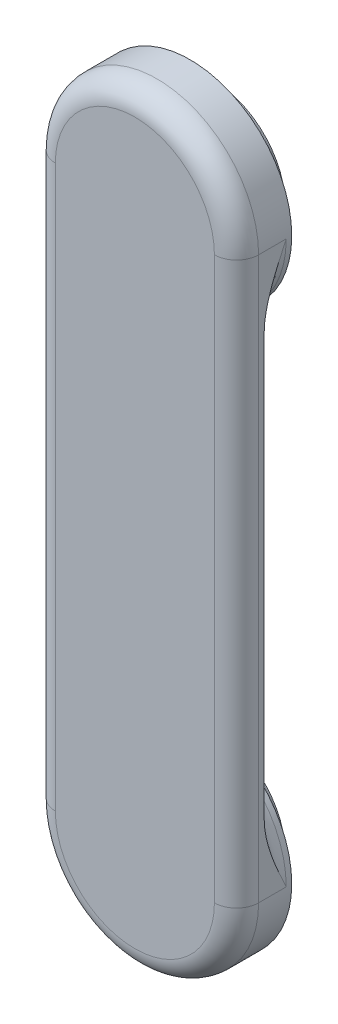
ISO-10303-21;
HEADER;
FILE_DESCRIPTION(('STEP AP214'),'2;1');
FILE_NAME('part.step','',(''),(''),'','','');
FILE_SCHEMA(('AUTOMOTIVE_DESIGN { 1 0 10303 214 1 1 1 1 }'));
ENDSEC;
DATA;
#1=APPLICATION_CONTEXT('core data for automotive mechanical design processes');
#2=APPLICATION_PROTOCOL_DEFINITION('international standard','automotive_design',2000,#1);
#3=PRODUCT_CONTEXT('',#1,'mechanical');
#4=PRODUCT('Part','Part','',(#3));
#5=PRODUCT_RELATED_PRODUCT_CATEGORY('part','',(#4));
#6=PRODUCT_DEFINITION_FORMATION('','',#4);
#7=PRODUCT_DEFINITION_CONTEXT('part definition',#1,'design');
#8=PRODUCT_DEFINITION('design','',#6,#7);
#9=PRODUCT_DEFINITION_SHAPE('','',#8);
#10=(LENGTH_UNIT() NAMED_UNIT(*) SI_UNIT(.MILLI.,.METRE.));
#11=(NAMED_UNIT(*) PLANE_ANGLE_UNIT() SI_UNIT($,.RADIAN.));
#12=(NAMED_UNIT(*) SI_UNIT($,.STERADIAN.) SOLID_ANGLE_UNIT());
#13=UNCERTAINTY_MEASURE_WITH_UNIT(LENGTH_MEASURE(1.E-05),#10,'distance_accuracy_value','');
#14=(GEOMETRIC_REPRESENTATION_CONTEXT(3) GLOBAL_UNCERTAINTY_ASSIGNED_CONTEXT((#13)) GLOBAL_UNIT_ASSIGNED_CONTEXT((#10,
#11,#12)) REPRESENTATION_CONTEXT('',''));
#15=CARTESIAN_POINT('',(0.,0.,0.));
#16=DIRECTION('',(0.,0.,1.));
#17=DIRECTION('',(1.,0.,0.));
#18=AXIS2_PLACEMENT_3D('',#15,#16,#17);
#19=CARTESIAN_POINT('',(0.,-31.75,3.125));
#20=DIRECTION('',(0.,0.,-1.));
#21=DIRECTION('',(-1.,0.,0.));
#22=AXIS2_PLACEMENT_3D('',#19,#20,#21);
#23=CYLINDRICAL_SURFACE('',#22,11.5);
#24=DIRECTION('',(0.,0.,-1.));
#25=VECTOR('',#24,1.);
#26=CARTESIAN_POINT('',(11.5,-31.75,3.125));
#27=LINE('',#26,#25);
#28=CARTESIAN_POINT('',(11.5,-31.75,0.625));
#29=VERTEX_POINT('',#28);
#30=CARTESIAN_POINT('',(11.5,-31.75,-2.5));
#31=VERTEX_POINT('',#30);
#32=EDGE_CURVE('E127',#29,#31,#27,.T.);
#33=ORIENTED_EDGE('',*,*,#32,.F.);
#34=CARTESIAN_POINT('',(0.,-31.75,0.625));
#35=DIRECTION('',(0.,0.,1.));
#36=DIRECTION('',(1.,0.,0.));
#37=AXIS2_PLACEMENT_3D('',#34,#35,#36);
#38=CIRCLE('',#37,11.5);
#39=CARTESIAN_POINT('',(-11.5,-31.75,0.625));
#40=VERTEX_POINT('',#39);
#41=EDGE_CURVE('E114',#29,#40,#38,.F.);
#42=ORIENTED_EDGE('',*,*,#41,.T.);
#43=DIRECTION('',(0.,0.,-1.));
#44=VECTOR('',#43,1.);
#45=CARTESIAN_POINT('',(-11.5,-31.75,3.125));
#46=LINE('',#45,#44);
#47=CARTESIAN_POINT('',(-11.5,-31.75,-2.5));
#48=VERTEX_POINT('',#47);
#49=EDGE_CURVE('E268',#40,#48,#46,.T.);
#50=ORIENTED_EDGE('',*,*,#49,.T.);
#51=CARTESIAN_POINT('',(0.,-31.75,-2.5));
#52=DIRECTION('',(0.,0.,1.));
#53=DIRECTION('',(1.,0.,0.));
#54=AXIS2_PLACEMENT_3D('',#51,#52,#53);
#55=CIRCLE('',#54,11.5);
#56=EDGE_CURVE('E133',#48,#31,#55,.F.);
#57=ORIENTED_EDGE('',*,*,#56,.T.);
#58=EDGE_LOOP('',(#33,#42,#50,#57));
#59=FACE_BOUND('',#58,.T.);
#60=CARTESIAN_POINT('',(0.,-31.75,-3.125));
#61=DIRECTION('',(0.,0.,1.));
#62=DIRECTION('',(1.,0.,0.));
#63=AXIS2_PLACEMENT_3D('',#60,#61,#62);
#64=CIRCLE('',#63,11.5);
#65=CARTESIAN_POINT('',(11.5,-31.75,-3.125));
#66=VERTEX_POINT('',#65);
#67=EDGE_CURVE('E255',#66,#66,#64,.T.);
#68=ORIENTED_EDGE('',*,*,#67,.T.);
#69=EDGE_LOOP('',(#68));
#70=FACE_BOUND('',#69,.T.);
#71=ADVANCED_FACE('F39',(#59,#70),#23,.T.);
#72=CARTESIAN_POINT('',(11.5,-31.75,3.125));
#73=DIRECTION('',(-1.,0.,0.));
#74=DIRECTION('',(0.,-1.,0.));
#75=AXIS2_PLACEMENT_3D('',#72,#73,#74);
#76=PLANE('',#75);
#77=DIRECTION('',(0.,0.,-1.));
#78=VECTOR('',#77,1.);
#79=CARTESIAN_POINT('',(11.5,31.75,3.125));
#80=LINE('',#79,#78);
#81=CARTESIAN_POINT('',(11.5,31.75,0.625));
#82=VERTEX_POINT('',#81);
#83=CARTESIAN_POINT('',(11.5,31.75,-2.5));
#84=VERTEX_POINT('',#83);
#85=EDGE_CURVE('E272',#82,#84,#80,.T.);
#86=ORIENTED_EDGE('',*,*,#85,.F.);
#87=DIRECTION('',(0.,1.,0.));
#88=VECTOR('',#87,1.);
#89=CARTESIAN_POINT('',(11.5,-31.75,0.625));
#90=LINE('',#89,#88);
#91=EDGE_CURVE('E165',#82,#29,#90,.F.);
#92=ORIENTED_EDGE('',*,*,#91,.T.);
#93=ORIENTED_EDGE('',*,*,#32,.T.);
#94=CARTESIAN_POINT('',(11.5,-23.7656402886643,0.));
#95=CARTESIAN_POINT('',(11.5,-23.911233276588,-1.69908867048966E-05));
#96=CARTESIAN_POINT('',(11.5,-24.0567808652085,-0.00413564646088903));
#97=CARTESIAN_POINT('',(11.5,-24.3473991352472,-0.0197827491516952));
#98=CARTESIAN_POINT('',(11.5,-24.4924700442399,-0.0313068988773102));
#99=CARTESIAN_POINT('',(11.5,-24.7815009163097,-0.060930517350268));
#100=CARTESIAN_POINT('',(11.5,-24.9254628768616,-0.0790109239360317));
#101=CARTESIAN_POINT('',(11.5,-25.2125326851877,-0.121081398249189));
#102=CARTESIAN_POINT('',(11.5,-25.355640392601,-0.145072411173628));
#103=CARTESIAN_POINT('',(11.5,-25.7800827335375,-0.224345309413198));
#104=CARTESIAN_POINT('',(11.5,-26.0599959733625,-0.287312732188905));
#105=CARTESIAN_POINT('',(11.5,-26.6156937928825,-0.429871238840334));
#106=CARTESIAN_POINT('',(11.5,-26.8914746704323,-0.509476373420126));
#107=CARTESIAN_POINT('',(11.5,-27.5577219639741,-0.719328390780933));
#108=CARTESIAN_POINT('',(11.5,-27.945975866679,-0.856553607015121));
#109=CARTESIAN_POINT('',(11.5,-28.7151363990288,-1.14983582712628));
#110=CARTESIAN_POINT('',(11.5,-29.0960429631533,-1.30589299884854));
#111=CARTESIAN_POINT('',(11.5,-30.2334696101424,-1.79296918467985));
#112=CARTESIAN_POINT('',(11.5,-30.982141111213,-2.14198441393279));
#113=CARTESIAN_POINT('',(11.5,-31.7370409800876,-2.49395784005223));
#114=CARTESIAN_POINT('',(11.5,-31.7435204961503,-2.49697893017229));
#115=CARTESIAN_POINT('',(11.5,-31.75,-2.5));
#116=B_SPLINE_CURVE_WITH_KNOTS('',3,(#94,#95,#96,#97,#98,#99,#100,#101,#102,#103,#104,#105,#106,
#107,#108,#109,#110,#111,#112,#113,#114,#115),.UNSPECIFIED.,.F.,.F.,(4,2,2,2,2,2,2,2,2,2,4),(0.,
0.436655710142863,0.873058258535008,1.30820201895334,1.74341541078459,2.60342762133128,
3.46416907639028,4.69875550959831,5.93335294722976,8.41066469203291,8.43211230262252),.UNSPECIFIED.);
#117=CARTESIAN_POINT('',(11.5,-23.7656402886643,0.));
#118=VERTEX_POINT('',#117);
#119=EDGE_CURVE('E63',#31,#118,#116,.F.);
#120=ORIENTED_EDGE('',*,*,#119,.T.);
#121=DIRECTION('',(0.,1.,0.));
#122=VECTOR('',#121,1.);
#123=CARTESIAN_POINT('',(11.5,-31.75,0.));
#124=LINE('',#123,#122);
#125=CARTESIAN_POINT('',(11.5,23.7656402886643,0.));
#126=VERTEX_POINT('',#125);
#127=EDGE_CURVE('E256',#118,#126,#124,.T.);
#128=ORIENTED_EDGE('',*,*,#127,.T.);
#129=CARTESIAN_POINT('',(11.5,23.7656402886643,0.));
#130=CARTESIAN_POINT('',(11.5,23.9112332765897,-1.69908867065897E-05));
#131=CARTESIAN_POINT('',(11.5,24.0567808652118,-0.00413564646098493));
#132=CARTESIAN_POINT('',(11.5,24.3473991352539,-0.0197827491521416));
#133=CARTESIAN_POINT('',(11.5,24.4924700442482,-0.0313068988780129));
#134=CARTESIAN_POINT('',(11.5,24.7815009163211,-0.0609305173515848));
#135=CARTESIAN_POINT('',(11.5,24.9254628768742,-0.0790109239376894));
#136=CARTESIAN_POINT('',(11.5,25.2125326852028,-0.121081398251606));
#137=CARTESIAN_POINT('',(11.5,25.3556403926175,-0.145072411176462));
#138=CARTESIAN_POINT('',(11.5,25.7800827335519,-0.224345309416372));
#139=CARTESIAN_POINT('',(11.5,26.0599959733737,-0.287312732191739));
#140=CARTESIAN_POINT('',(11.5,26.6156937928879,-0.429871238841776));
#141=CARTESIAN_POINT('',(11.5,26.8914746704351,-0.509476373420537));
#142=CARTESIAN_POINT('',(11.5,27.5577219639734,-0.719328390781423));
#143=CARTESIAN_POINT('',(11.5,27.9459758666769,-0.856553607017611));
#144=CARTESIAN_POINT('',(11.5,28.7151363990278,-1.14983582712268));
#145=CARTESIAN_POINT('',(11.5,29.0960429631549,-1.30589299883681));
#146=CARTESIAN_POINT('',(11.4999999999999,30.2334696101299,-1.79296918469948));
#147=CARTESIAN_POINT('',(11.4999999999995,30.9821411111582,-2.14198441404679));
#148=CARTESIAN_POINT('',(11.5,31.7370409800867,-2.49395784005423));
#149=CARTESIAN_POINT('',(11.5,31.7435204961498,-2.49697893017329));
#150=CARTESIAN_POINT('',(11.5,31.75,-2.5));
#151=B_SPLINE_CURVE_WITH_KNOTS('',3,(#129,#130,#131,#132,#133,#134,#135,#136,#137,#138,#139,
#140,#141,#142,#143,#144,#145,#146,#147,#148,#149,#150),.UNSPECIFIED.,.F.,.F.,(4,2,2,2,2,2,2,2,
2,2,4),(0.,0.43665571014791,0.873058258545101,1.30820201896739,1.74341541080258,
2.60342762133969,3.46416907639026,4.6987555095971,5.93335294722516,8.41066469203293,
8.4321123026225),.UNSPECIFIED.);
#152=EDGE_CURVE('E48',#126,#84,#151,.T.);
#153=ORIENTED_EDGE('',*,*,#152,.T.);
#154=EDGE_LOOP('',(#86,#92,#93,#120,#128,#153));
#155=FACE_BOUND('',#154,.T.);
#156=ADVANCED_FACE('F217',(#155),#76,.F.);
#157=CARTESIAN_POINT('',(0.,31.75,3.125));
#158=DIRECTION('',(0.,0.,-1.));
#159=DIRECTION('',(-1.,0.,0.));
#160=AXIS2_PLACEMENT_3D('',#157,#158,#159);
#161=CYLINDRICAL_SURFACE('',#160,11.5);
#162=DIRECTION('',(0.,0.,-1.));
#163=VECTOR('',#162,1.);
#164=CARTESIAN_POINT('',(-11.5,31.75,3.125));
#165=LINE('',#164,#163);
#166=CARTESIAN_POINT('',(-11.5,31.75,0.625));
#167=VERTEX_POINT('',#166);
#168=CARTESIAN_POINT('',(-11.5,31.75,-2.5));
#169=VERTEX_POINT('',#168);
#170=EDGE_CURVE('E270',#167,#169,#165,.T.);
#171=ORIENTED_EDGE('',*,*,#170,.F.);
#172=CARTESIAN_POINT('',(0.,31.75,0.625));
#173=DIRECTION('',(0.,0.,1.));
#174=DIRECTION('',(1.,0.,0.));
#175=AXIS2_PLACEMENT_3D('',#172,#173,#174);
#176=CIRCLE('',#175,11.5);
#177=EDGE_CURVE('E146',#167,#82,#176,.F.);
#178=ORIENTED_EDGE('',*,*,#177,.T.);
#179=ORIENTED_EDGE('',*,*,#85,.T.);
#180=CARTESIAN_POINT('',(0.,31.75,-2.5));
#181=DIRECTION('',(0.,0.,1.));
#182=DIRECTION('',(1.,0.,0.));
#183=AXIS2_PLACEMENT_3D('',#180,#181,#182);
#184=CIRCLE('',#183,11.5);
#185=EDGE_CURVE('E143',#84,#169,#184,.F.);
#186=ORIENTED_EDGE('',*,*,#185,.T.);
#187=EDGE_LOOP('',(#171,#178,#179,#186));
#188=FACE_BOUND('',#187,.T.);
#189=CARTESIAN_POINT('',(0.,31.75,-3.125));
#190=DIRECTION('',(0.,0.,1.));
#191=DIRECTION('',(1.,0.,0.));
#192=AXIS2_PLACEMENT_3D('',#189,#190,#191);
#193=CIRCLE('',#192,11.5);
#194=CARTESIAN_POINT('',(11.5,31.75,-3.125));
#195=VERTEX_POINT('',#194);
#196=EDGE_CURVE('E257',#195,#195,#193,.T.);
#197=ORIENTED_EDGE('',*,*,#196,.T.);
#198=EDGE_LOOP('',(#197));
#199=FACE_BOUND('',#198,.T.);
#200=ADVANCED_FACE('F190',(#188,#199),#161,.T.);
#201=CARTESIAN_POINT('',(-11.5,-31.75,3.125));
#202=DIRECTION('',(-1.,0.,0.));
#203=DIRECTION('',(0.,-1.,0.));
#204=AXIS2_PLACEMENT_3D('',#201,#202,#203);
#205=PLANE('',#204);
#206=ORIENTED_EDGE('',*,*,#49,.F.);
#207=DIRECTION('',(0.,1.,0.));
#208=VECTOR('',#207,1.);
#209=CARTESIAN_POINT('',(-11.5,-31.75,0.625));
#210=LINE('',#209,#208);
#211=EDGE_CURVE('E141',#40,#167,#210,.T.);
#212=ORIENTED_EDGE('',*,*,#211,.T.);
#213=ORIENTED_EDGE('',*,*,#170,.T.);
#214=CARTESIAN_POINT('',(-11.5,23.7656402886644,0.));
#215=CARTESIAN_POINT('',(-11.5,23.9112332765866,-1.69908867034258E-05));
#216=CARTESIAN_POINT('',(-11.5,24.0567808652056,-0.00413564646080563));
#217=CARTESIAN_POINT('',(-11.5,24.3473991352414,-0.0197827491513076));
#218=CARTESIAN_POINT('',(-11.5,24.4924700442326,-0.0313068988767002));
#219=CARTESIAN_POINT('',(-11.5,24.7815009162999,-0.0609305173491257));
#220=CARTESIAN_POINT('',(-11.5,24.9254628768507,-0.0790109239345938));
#221=CARTESIAN_POINT('',(-11.5,25.2125326851745,-0.121081398247092));
#222=CARTESIAN_POINT('',(-11.5,25.3556403925868,-0.145072411171168));
#223=CARTESIAN_POINT('',(-11.5,25.7800827335249,-0.224345309410442));
#224=CARTESIAN_POINT('',(-11.5,26.0599959733527,-0.287312732186442));
#225=CARTESIAN_POINT('',(-11.5,26.6156937928778,-0.429871238839079));
#226=CARTESIAN_POINT('',(-11.5,26.8914746704298,-0.509476373419766));
#227=CARTESIAN_POINT('',(-11.5,27.5577219639747,-0.719328390780506));
#228=CARTESIAN_POINT('',(-11.5,27.9459758666808,-0.856553607012961));
#229=CARTESIAN_POINT('',(-11.5,28.7151363990296,-1.14983582712942));
#230=CARTESIAN_POINT('',(-11.5,29.0960429631519,-1.30589299885873));
#231=CARTESIAN_POINT('',(-11.5,30.2334696101534,-1.79296918466283));
#232=CARTESIAN_POINT('',(-11.5000000000002,30.9821411112606,-2.14198441383389));
#233=CARTESIAN_POINT('',(-11.5,31.7370409800884,-2.49395784005053));
#234=CARTESIAN_POINT('',(-11.5,31.7435204961507,-2.49697893017143));
#235=CARTESIAN_POINT('',(-11.5,31.75,-2.5));
#236=B_SPLINE_CURVE_WITH_KNOTS('',3,(#214,#215,#216,#217,#218,#219,#220,#221,#222,#223,#224,
#225,#226,#227,#228,#229,#230,#231,#232,#233,#234,#235),.UNSPECIFIED.,.F.,.F.,(4,2,2,2,2,2,2,2,
2,2,4),(0.,0.436655710138497,0.87305825852626,1.30820201894116,1.74341541076897,
2.60342762132397,3.4641690763903,4.69875550959936,5.93335294723379,8.41066469203296,
8.43211230262253),.UNSPECIFIED.);
#237=CARTESIAN_POINT('',(-11.5,23.7656402886644,0.));
#238=VERTEX_POINT('',#237);
#239=EDGE_CURVE('E11',#169,#238,#236,.F.);
#240=ORIENTED_EDGE('',*,*,#239,.T.);
#241=DIRECTION('',(0.,1.,0.));
#242=VECTOR('',#241,1.);
#243=CARTESIAN_POINT('',(-11.5,-31.75,0.));
#244=LINE('',#243,#242);
#245=CARTESIAN_POINT('',(-11.5,-23.7656402886643,0.));
#246=VERTEX_POINT('',#245);
#247=EDGE_CURVE('E259',#246,#238,#244,.T.);
#248=ORIENTED_EDGE('',*,*,#247,.F.);
#249=CARTESIAN_POINT('',(-11.5,-23.7656402886643,0.));
#250=CARTESIAN_POINT('',(-11.5,-23.911233276588,-1.69908867048354E-05));
#251=CARTESIAN_POINT('',(-11.5,-24.0567808652085,-0.0041356464608884));
#252=CARTESIAN_POINT('',(-11.5,-24.3473991352472,-0.019782749151693));
#253=CARTESIAN_POINT('',(-11.5,-24.4924700442398,-0.0313068988773071));
#254=CARTESIAN_POINT('',(-11.5,-24.7815009163097,-0.0609305173502631));
#255=CARTESIAN_POINT('',(-11.5,-24.9254628768616,-0.0790109239360258));
#256=CARTESIAN_POINT('',(-11.5,-25.2125326851876,-0.121081398249181));
#257=CARTESIAN_POINT('',(-11.5,-25.355640392601,-0.145072411173618));
#258=CARTESIAN_POINT('',(-11.5,-25.7800827335374,-0.224345309413188));
#259=CARTESIAN_POINT('',(-11.5,-26.0599959733624,-0.287312732188895));
#260=CARTESIAN_POINT('',(-11.5,-26.6156937928824,-0.429871238840328));
#261=CARTESIAN_POINT('',(-11.5,-26.8914746704323,-0.509476373420122));
#262=CARTESIAN_POINT('',(-11.5,-27.5577219639741,-0.719328390780929));
#263=CARTESIAN_POINT('',(-11.5,-27.945975866679,-0.856553607015113));
#264=CARTESIAN_POINT('',(-11.5,-28.7151363990288,-1.14983582712629));
#265=CARTESIAN_POINT('',(-11.5,-29.0960429631533,-1.30589299884857));
#266=CARTESIAN_POINT('',(-11.5,-30.2334696101425,-1.79296918467979));
#267=CARTESIAN_POINT('',(-11.5,-30.9821411112131,-2.14198441393246));
#268=CARTESIAN_POINT('',(-11.5,-31.7370409800876,-2.49395784005223));
#269=CARTESIAN_POINT('',(-11.5,-31.7435204961503,-2.49697893017228));
#270=CARTESIAN_POINT('',(-11.5,-31.75,-2.5));
#271=B_SPLINE_CURVE_WITH_KNOTS('',3,(#249,#250,#251,#252,#253,#254,#255,#256,#257,#258,#259,
#260,#261,#262,#263,#264,#265,#266,#267,#268,#269,#270),.UNSPECIFIED.,.F.,.F.,(4,2,2,2,2,2,2,2,
2,2,4),(0.,0.436655710142849,0.87305825853498,1.3082020189533,1.74341541078453,2.60342762133125,
3.46416907639028,4.69875550959831,5.93335294722978,8.41066469203292,8.43211230262252),.UNSPECIFIED.);
#272=EDGE_CURVE('E167',#246,#48,#271,.T.);
#273=ORIENTED_EDGE('',*,*,#272,.T.);
#274=EDGE_LOOP('',(#206,#212,#213,#240,#248,#273));
#275=FACE_BOUND('',#274,.T.);
#276=ADVANCED_FACE('F185',(#275),#205,.T.);
#277=CARTESIAN_POINT('',(0.,-31.75,3.125));
#278=DIRECTION('',(0.,0.,1.));
#279=DIRECTION('',(1.,0.,0.));
#280=AXIS2_PLACEMENT_3D('',#277,#278,#279);
#281=PLANE('',#280);
#282=DIRECTION('',(0.,1.,0.));
#283=VECTOR('',#282,1.);
#284=CARTESIAN_POINT('',(-8.99999999999999,-31.75,3.125));
#285=LINE('',#284,#283);
#286=CARTESIAN_POINT('',(-8.99999999999999,31.75,3.125));
#287=VERTEX_POINT('',#286);
#288=CARTESIAN_POINT('',(-8.99999999999999,-31.75,3.125));
#289=VERTEX_POINT('',#288);
#290=EDGE_CURVE('E131',#287,#289,#285,.F.);
#291=ORIENTED_EDGE('',*,*,#290,.T.);
#292=CARTESIAN_POINT('',(0.,-31.75,3.125));
#293=DIRECTION('',(0.,0.,1.));
#294=DIRECTION('',(1.,0.,0.));
#295=AXIS2_PLACEMENT_3D('',#292,#293,#294);
#296=CIRCLE('',#295,8.99999999999999);
#297=CARTESIAN_POINT('',(8.99999999999999,-31.75,3.125));
#298=VERTEX_POINT('',#297);
#299=EDGE_CURVE('E112',#289,#298,#296,.T.);
#300=ORIENTED_EDGE('',*,*,#299,.T.);
#301=DIRECTION('',(0.,1.,0.));
#302=VECTOR('',#301,1.);
#303=CARTESIAN_POINT('',(8.99999999999998,31.75,3.125));
#304=LINE('',#303,#302);
#305=CARTESIAN_POINT('',(8.99999999999998,31.75,3.125));
#306=VERTEX_POINT('',#305);
#307=EDGE_CURVE('E120',#298,#306,#304,.T.);
#308=ORIENTED_EDGE('',*,*,#307,.T.);
#309=CARTESIAN_POINT('',(0.,31.75,3.125));
#310=DIRECTION('',(0.,0.,1.));
#311=DIRECTION('',(1.,0.,0.));
#312=AXIS2_PLACEMENT_3D('',#309,#310,#311);
#313=CIRCLE('',#312,8.99999999999999);
#314=EDGE_CURVE('E126',#306,#287,#313,.T.);
#315=ORIENTED_EDGE('',*,*,#314,.T.);
#316=EDGE_LOOP('',(#291,#300,#308,#315));
#317=FACE_BOUND('',#316,.T.);
#318=ADVANCED_FACE('F129',(#317),#281,.T.);
#319=CARTESIAN_POINT('',(0.,-31.75,0.));
#320=DIRECTION('',(0.,0.,1.));
#321=DIRECTION('',(1.,0.,0.));
#322=AXIS2_PLACEMENT_3D('',#319,#320,#321);
#323=PLANE('',#322);
#324=ORIENTED_EDGE('',*,*,#127,.F.);
#325=CARTESIAN_POINT('',(0.,-31.75,0.));
#326=DIRECTION('',(0.,0.,1.));
#327=DIRECTION('',(1.,0.,0.));
#328=AXIS2_PLACEMENT_3D('',#325,#326,#327);
#329=CIRCLE('',#328,14.);
#330=EDGE_CURVE('E156',#118,#246,#329,.T.);
#331=ORIENTED_EDGE('',*,*,#330,.T.);
#332=ORIENTED_EDGE('',*,*,#247,.T.);
#333=CARTESIAN_POINT('',(0.,31.75,0.));
#334=DIRECTION('',(0.,0.,1.));
#335=DIRECTION('',(1.,0.,0.));
#336=AXIS2_PLACEMENT_3D('',#333,#334,#335);
#337=CIRCLE('',#336,14.);
#338=EDGE_CURVE('E154',#238,#126,#337,.T.);
#339=ORIENTED_EDGE('',*,*,#338,.T.);
#340=EDGE_LOOP('',(#324,#331,#332,#339));
#341=FACE_BOUND('',#340,.T.);
#342=ADVANCED_FACE('F192',(#341),#323,.F.);
#343=CARTESIAN_POINT('',(0.,-31.75,-3.125));
#344=DIRECTION('',(0.,0.,1.));
#345=DIRECTION('',(1.,0.,0.));
#346=AXIS2_PLACEMENT_3D('',#343,#344,#345);
#347=PLANE('',#346);
#348=CARTESIAN_POINT('',(0.,-31.75,-3.125));
#349=DIRECTION('',(0.,0.,1.));
#350=DIRECTION('',(1.,0.,0.));
#351=AXIS2_PLACEMENT_3D('',#348,#349,#350);
#352=CIRCLE('',#351,10.625);
#353=CARTESIAN_POINT('',(10.625,-31.75,-3.125));
#354=VERTEX_POINT('',#353);
#355=EDGE_CURVE('E148',#354,#354,#352,.T.);
#356=ORIENTED_EDGE('',*,*,#355,.T.);
#357=EDGE_LOOP('',(#356));
#358=FACE_BOUND('',#357,.T.);
#359=ORIENTED_EDGE('',*,*,#67,.F.);
#360=EDGE_LOOP('',(#359));
#361=FACE_BOUND('',#360,.T.);
#362=ADVANCED_FACE('F248',(#358,#361),#347,.F.);
#363=CARTESIAN_POINT('',(0.,31.75,-3.125));
#364=DIRECTION('',(0.,0.,1.));
#365=DIRECTION('',(1.,0.,0.));
#366=AXIS2_PLACEMENT_3D('',#363,#364,#365);
#367=PLANE('',#366);
#368=CARTESIAN_POINT('',(0.,31.75,-3.125));
#369=DIRECTION('',(0.,0.,1.));
#370=DIRECTION('',(1.,0.,0.));
#371=AXIS2_PLACEMENT_3D('',#368,#369,#370);
#372=CIRCLE('',#371,10.625);
#373=CARTESIAN_POINT('',(10.625,31.75,-3.125));
#374=VERTEX_POINT('',#373);
#375=EDGE_CURVE('E159',#374,#374,#372,.T.);
#376=ORIENTED_EDGE('',*,*,#375,.T.);
#377=EDGE_LOOP('',(#376));
#378=FACE_BOUND('',#377,.T.);
#379=ORIENTED_EDGE('',*,*,#196,.F.);
#380=EDGE_LOOP('',(#379));
#381=FACE_BOUND('',#380,.T.);
#382=ADVANCED_FACE('F251',(#378,#381),#367,.F.);
#383=CARTESIAN_POINT('',(0.,31.75,-5.75));
#384=DIRECTION('',(0.,0.,1.));
#385=DIRECTION('',(1.,0.,0.));
#386=AXIS2_PLACEMENT_3D('',#383,#384,#385);
#387=CYLINDRICAL_SURFACE('',#386,8.125);
#388=CARTESIAN_POINT('',(0.,31.75,-5.625));
#389=DIRECTION('',(0.,0.,1.));
#390=DIRECTION('',(1.,0.,0.));
#391=AXIS2_PLACEMENT_3D('',#388,#389,#390);
#392=CIRCLE('',#391,8.125);
#393=CARTESIAN_POINT('',(8.125,31.75,-5.625));
#394=VERTEX_POINT('',#393);
#395=EDGE_CURVE('E162',#394,#394,#392,.F.);
#396=ORIENTED_EDGE('',*,*,#395,.T.);
#397=EDGE_LOOP('',(#396));
#398=FACE_BOUND('',#397,.T.);
#399=CARTESIAN_POINT('',(0.,31.75,-5.75));
#400=DIRECTION('',(0.,0.,1.));
#401=DIRECTION('',(1.,0.,0.));
#402=AXIS2_PLACEMENT_3D('',#399,#400,#401);
#403=CIRCLE('',#402,8.125);
#404=CARTESIAN_POINT('',(8.125,31.75,-5.75));
#405=VERTEX_POINT('',#404);
#406=EDGE_CURVE('E262',#405,#405,#403,.T.);
#407=ORIENTED_EDGE('',*,*,#406,.T.);
#408=EDGE_LOOP('',(#407));
#409=FACE_BOUND('',#408,.T.);
#410=ADVANCED_FACE('F297',(#398,#409),#387,.T.);
#411=CARTESIAN_POINT('',(0.,31.75,-5.75));
#412=DIRECTION('',(0.,0.,1.));
#413=DIRECTION('',(1.,0.,0.));
#414=AXIS2_PLACEMENT_3D('',#411,#412,#413);
#415=PLANE('',#414);
#416=CARTESIAN_POINT('',(0.,31.75,-5.75));
#417=DIRECTION('',(0.,0.,-1.));
#418=DIRECTION('',(-1.,0.,0.));
#419=AXIS2_PLACEMENT_3D('',#416,#417,#418);
#420=CIRCLE('',#419,7.5);
#421=CARTESIAN_POINT('',(-7.5,31.75,-5.75));
#422=VERTEX_POINT('',#421);
#423=EDGE_CURVE('E333',#422,#422,#420,.T.);
#424=ORIENTED_EDGE('',*,*,#423,.F.);
#425=EDGE_LOOP('',(#424));
#426=FACE_BOUND('',#425,.T.);
#427=ORIENTED_EDGE('',*,*,#406,.F.);
#428=EDGE_LOOP('',(#427));
#429=FACE_BOUND('',#428,.T.);
#430=ADVANCED_FACE('F301',(#426,#429),#415,.F.);
#431=CARTESIAN_POINT('',(0.,-31.75,-5.75));
#432=DIRECTION('',(0.,0.,1.));
#433=DIRECTION('',(1.,0.,0.));
#434=AXIS2_PLACEMENT_3D('',#431,#432,#433);
#435=CYLINDRICAL_SURFACE('',#434,8.125);
#436=CARTESIAN_POINT('',(0.,-31.75,-5.625));
#437=DIRECTION('',(0.,0.,1.));
#438=DIRECTION('',(1.,0.,0.));
#439=AXIS2_PLACEMENT_3D('',#436,#437,#438);
#440=CIRCLE('',#439,8.125);
#441=CARTESIAN_POINT('',(8.125,-31.75,-5.625));
#442=VERTEX_POINT('',#441);
#443=EDGE_CURVE('E151',#442,#442,#440,.F.);
#444=ORIENTED_EDGE('',*,*,#443,.T.);
#445=EDGE_LOOP('',(#444));
#446=FACE_BOUND('',#445,.T.);
#447=CARTESIAN_POINT('',(0.,-31.75,-5.75));
#448=DIRECTION('',(0.,0.,1.));
#449=DIRECTION('',(1.,0.,0.));
#450=AXIS2_PLACEMENT_3D('',#447,#448,#449);
#451=CIRCLE('',#450,8.125);
#452=CARTESIAN_POINT('',(8.125,-31.75,-5.75));
#453=VERTEX_POINT('',#452);
#454=EDGE_CURVE('E332',#453,#453,#451,.T.);
#455=ORIENTED_EDGE('',*,*,#454,.T.);
#456=EDGE_LOOP('',(#455));
#457=FACE_BOUND('',#456,.T.);
#458=ADVANCED_FACE('F305',(#446,#457),#435,.T.);
#459=CARTESIAN_POINT('',(0.,-31.75,-5.75));
#460=DIRECTION('',(0.,0.,1.));
#461=DIRECTION('',(1.,0.,0.));
#462=AXIS2_PLACEMENT_3D('',#459,#460,#461);
#463=PLANE('',#462);
#464=CARTESIAN_POINT('',(0.,-31.75,-5.75));
#465=DIRECTION('',(0.,0.,-1.));
#466=DIRECTION('',(-1.,0.,0.));
#467=AXIS2_PLACEMENT_3D('',#464,#465,#466);
#468=CIRCLE('',#467,7.5);
#469=CARTESIAN_POINT('',(-7.5,-31.75,-5.75));
#470=VERTEX_POINT('',#469);
#471=EDGE_CURVE('E338',#470,#470,#468,.T.);
#472=ORIENTED_EDGE('',*,*,#471,.F.);
#473=EDGE_LOOP('',(#472));
#474=FACE_BOUND('',#473,.T.);
#475=ORIENTED_EDGE('',*,*,#454,.F.);
#476=EDGE_LOOP('',(#475));
#477=FACE_BOUND('',#476,.T.);
#478=ADVANCED_FACE('F307',(#474,#477),#463,.F.);
#479=CARTESIAN_POINT('',(0.,-31.75,0.));
#480=DIRECTION('',(0.,0.,-1.));
#481=DIRECTION('',(-1.,0.,0.));
#482=AXIS2_PLACEMENT_3D('',#479,#480,#481);
#483=CYLINDRICAL_SURFACE('',#482,7.5);
#484=CARTESIAN_POINT('',(0.,-31.75,0.));
#485=DIRECTION('',(0.,0.,-1.));
#486=DIRECTION('',(-1.,0.,0.));
#487=AXIS2_PLACEMENT_3D('',#484,#485,#486);
#488=CIRCLE('',#487,7.5);
#489=CARTESIAN_POINT('',(-7.5,-31.75,0.));
#490=VERTEX_POINT('',#489);
#491=EDGE_CURVE('E278',#490,#490,#488,.T.);
#492=ORIENTED_EDGE('',*,*,#491,.F.);
#493=EDGE_LOOP('',(#492));
#494=FACE_BOUND('',#493,.T.);
#495=ORIENTED_EDGE('',*,*,#471,.T.);
#496=EDGE_LOOP('',(#495));
#497=FACE_BOUND('',#496,.T.);
#498=ADVANCED_FACE('F310',(#494,#497),#483,.F.);
#499=CARTESIAN_POINT('',(0.,-31.75,0.));
#500=DIRECTION('',(0.,0.,-1.));
#501=DIRECTION('',(-1.,0.,0.));
#502=AXIS2_PLACEMENT_3D('',#499,#500,#501);
#503=PLANE('',#502);
#504=ORIENTED_EDGE('',*,*,#491,.T.);
#505=EDGE_LOOP('',(#504));
#506=FACE_BOUND('',#505,.T.);
#507=ADVANCED_FACE('F315',(#506),#503,.T.);
#508=CARTESIAN_POINT('',(0.,31.75,0.));
#509=DIRECTION('',(0.,0.,-1.));
#510=DIRECTION('',(-1.,0.,0.));
#511=AXIS2_PLACEMENT_3D('',#508,#509,#510);
#512=CYLINDRICAL_SURFACE('',#511,7.5);
#513=CARTESIAN_POINT('',(0.,31.75,0.));
#514=DIRECTION('',(0.,0.,-1.));
#515=DIRECTION('',(-1.,0.,0.));
#516=AXIS2_PLACEMENT_3D('',#513,#514,#515);
#517=CIRCLE('',#516,7.5);
#518=CARTESIAN_POINT('',(-7.5,31.75,0.));
#519=VERTEX_POINT('',#518);
#520=EDGE_CURVE('E331',#519,#519,#517,.T.);
#521=ORIENTED_EDGE('',*,*,#520,.F.);
#522=EDGE_LOOP('',(#521));
#523=FACE_BOUND('',#522,.T.);
#524=ORIENTED_EDGE('',*,*,#423,.T.);
#525=EDGE_LOOP('',(#524));
#526=FACE_BOUND('',#525,.T.);
#527=ADVANCED_FACE('F318',(#523,#526),#512,.F.);
#528=CARTESIAN_POINT('',(0.,31.75,0.));
#529=DIRECTION('',(0.,0.,-1.));
#530=DIRECTION('',(-1.,0.,0.));
#531=AXIS2_PLACEMENT_3D('',#528,#529,#530);
#532=PLANE('',#531);
#533=ORIENTED_EDGE('',*,*,#520,.T.);
#534=EDGE_LOOP('',(#533));
#535=FACE_BOUND('',#534,.T.);
#536=ADVANCED_FACE('F238',(#535),#532,.T.);
#537=CARTESIAN_POINT('',(0.,31.75,0.625));
#538=DIRECTION('',(0.,0.,1.));
#539=DIRECTION('',(1.,0.,0.));
#540=AXIS2_PLACEMENT_3D('',#537,#538,#539);
#541=TOROIDAL_SURFACE('',#540,8.99999999999999,2.5);
#542=CARTESIAN_POINT('',(8.99999999999999,31.75,0.625));
#543=DIRECTION('',(0.,-1.,0.));
#544=DIRECTION('',(0.,0.,-1.));
#545=AXIS2_PLACEMENT_3D('',#542,#543,#544);
#546=CIRCLE('',#545,2.5);
#547=EDGE_CURVE('E123',#82,#306,#546,.T.);
#548=ORIENTED_EDGE('',*,*,#547,.F.);
#549=ORIENTED_EDGE('',*,*,#177,.F.);
#550=CARTESIAN_POINT('',(-8.99999999999999,31.75,0.625));
#551=DIRECTION('',(0.,-1.,0.));
#552=DIRECTION('',(0.,0.,-1.));
#553=AXIS2_PLACEMENT_3D('',#550,#551,#552);
#554=CIRCLE('',#553,2.5);
#555=EDGE_CURVE('E43',#287,#167,#554,.T.);
#556=ORIENTED_EDGE('',*,*,#555,.F.);
#557=ORIENTED_EDGE('',*,*,#314,.F.);
#558=EDGE_LOOP('',(#548,#549,#556,#557));
#559=FACE_BOUND('',#558,.T.);
#560=ADVANCED_FACE('F235',(#559),#541,.T.);
#561=CARTESIAN_POINT('',(-8.99999999999999,-31.75,0.625));
#562=DIRECTION('',(0.,1.,0.));
#563=DIRECTION('',(-1.,0.,0.));
#564=AXIS2_PLACEMENT_3D('',#561,#562,#563);
#565=CYLINDRICAL_SURFACE('',#564,2.5);
#566=ORIENTED_EDGE('',*,*,#555,.T.);
#567=ORIENTED_EDGE('',*,*,#211,.F.);
#568=CARTESIAN_POINT('',(-8.99999999999999,-31.75,0.625));
#569=DIRECTION('',(0.,-1.,0.));
#570=DIRECTION('',(0.,0.,-1.));
#571=AXIS2_PLACEMENT_3D('',#568,#569,#570);
#572=CIRCLE('',#571,2.5);
#573=EDGE_CURVE('E117',#289,#40,#572,.T.);
#574=ORIENTED_EDGE('',*,*,#573,.F.);
#575=ORIENTED_EDGE('',*,*,#290,.F.);
#576=EDGE_LOOP('',(#566,#567,#574,#575));
#577=FACE_BOUND('',#576,.T.);
#578=ADVANCED_FACE('F232',(#577),#565,.T.);
#579=CARTESIAN_POINT('',(8.99999999999999,-31.75,0.625));
#580=DIRECTION('',(0.,-1.,0.));
#581=DIRECTION('',(1.,0.,0.));
#582=AXIS2_PLACEMENT_3D('',#579,#580,#581);
#583=CYLINDRICAL_SURFACE('',#582,2.5);
#584=ORIENTED_EDGE('',*,*,#547,.T.);
#585=ORIENTED_EDGE('',*,*,#307,.F.);
#586=CARTESIAN_POINT('',(8.99999999999999,-31.75,0.625));
#587=DIRECTION('',(0.,-1.,0.));
#588=DIRECTION('',(0.,0.,-1.));
#589=AXIS2_PLACEMENT_3D('',#586,#587,#588);
#590=CIRCLE('',#589,2.5);
#591=EDGE_CURVE('E108',#29,#298,#590,.T.);
#592=ORIENTED_EDGE('',*,*,#591,.F.);
#593=ORIENTED_EDGE('',*,*,#91,.F.);
#594=EDGE_LOOP('',(#584,#585,#592,#593));
#595=FACE_BOUND('',#594,.T.);
#596=ADVANCED_FACE('F121',(#595),#583,.T.);
#597=CARTESIAN_POINT('',(0.,-31.75,0.625));
#598=DIRECTION('',(0.,0.,1.));
#599=DIRECTION('',(1.,0.,0.));
#600=AXIS2_PLACEMENT_3D('',#597,#598,#599);
#601=TOROIDAL_SURFACE('',#600,8.99999999999999,2.5);
#602=ORIENTED_EDGE('',*,*,#573,.T.);
#603=ORIENTED_EDGE('',*,*,#41,.F.);
#604=ORIENTED_EDGE('',*,*,#591,.T.);
#605=ORIENTED_EDGE('',*,*,#299,.F.);
#606=EDGE_LOOP('',(#602,#603,#604,#605));
#607=FACE_BOUND('',#606,.T.);
#608=ADVANCED_FACE('F110',(#607),#601,.T.);
#609=CARTESIAN_POINT('',(0.,-31.75,-5.625));
#610=DIRECTION('',(0.,0.,1.));
#611=DIRECTION('',(1.,0.,0.));
#612=AXIS2_PLACEMENT_3D('',#609,#610,#611);
#613=TOROIDAL_SURFACE('',#612,10.625,2.5);
#614=ORIENTED_EDGE('',*,*,#443,.F.);
#615=EDGE_LOOP('',(#614));
#616=FACE_BOUND('',#615,.T.);
#617=ORIENTED_EDGE('',*,*,#355,.F.);
#618=EDGE_LOOP('',(#617));
#619=FACE_BOUND('',#618,.T.);
#620=ADVANCED_FACE('F213',(#616,#619),#613,.F.);
#621=CARTESIAN_POINT('',(0.,-31.75,-2.5));
#622=DIRECTION('',(0.,0.,1.));
#623=DIRECTION('',(1.,0.,0.));
#624=AXIS2_PLACEMENT_3D('',#621,#622,#623);
#625=TOROIDAL_SURFACE('',#624,14.,2.5);
#626=ORIENTED_EDGE('',*,*,#119,.F.);
#627=ORIENTED_EDGE('',*,*,#56,.F.);
#628=ORIENTED_EDGE('',*,*,#272,.F.);
#629=ORIENTED_EDGE('',*,*,#330,.F.);
#630=EDGE_LOOP('',(#626,#627,#628,#629));
#631=FACE_BOUND('',#630,.T.);
#632=ADVANCED_FACE('F182',(#631),#625,.F.);
#633=CARTESIAN_POINT('',(0.,31.75,-2.5));
#634=DIRECTION('',(0.,0.,1.));
#635=DIRECTION('',(1.,0.,0.));
#636=AXIS2_PLACEMENT_3D('',#633,#634,#635);
#637=TOROIDAL_SURFACE('',#636,14.,2.5);
#638=ORIENTED_EDGE('',*,*,#239,.F.);
#639=ORIENTED_EDGE('',*,*,#185,.F.);
#640=ORIENTED_EDGE('',*,*,#152,.F.);
#641=ORIENTED_EDGE('',*,*,#338,.F.);
#642=EDGE_LOOP('',(#638,#639,#640,#641));
#643=FACE_BOUND('',#642,.T.);
#644=ADVANCED_FACE('F204',(#643),#637,.F.);
#645=CARTESIAN_POINT('',(0.,31.75,-5.625));
#646=DIRECTION('',(0.,0.,1.));
#647=DIRECTION('',(1.,0.,0.));
#648=AXIS2_PLACEMENT_3D('',#645,#646,#647);
#649=TOROIDAL_SURFACE('',#648,10.625,2.5);
#650=ORIENTED_EDGE('',*,*,#395,.F.);
#651=EDGE_LOOP('',(#650));
#652=FACE_BOUND('',#651,.T.);
#653=ORIENTED_EDGE('',*,*,#375,.F.);
#654=EDGE_LOOP('',(#653));
#655=FACE_BOUND('',#654,.T.);
#656=ADVANCED_FACE('F41',(#652,#655),#649,.F.);
#657=CLOSED_SHELL('',(#71,#156,#200,#276,#318,#342,#362,#382,#410,#430,#458,#478,#498,#507,#527,
#536,#560,#578,#596,#608,#620,#632,#644,#656));
#658=MANIFOLD_SOLID_BREP('B2',#657);
#659=ADVANCED_BREP_SHAPE_REPRESENTATION('',(#18,#658),#14);
#660=SHAPE_DEFINITION_REPRESENTATION(#9,#659);
ENDSEC;
END-ISO-10303-21;
